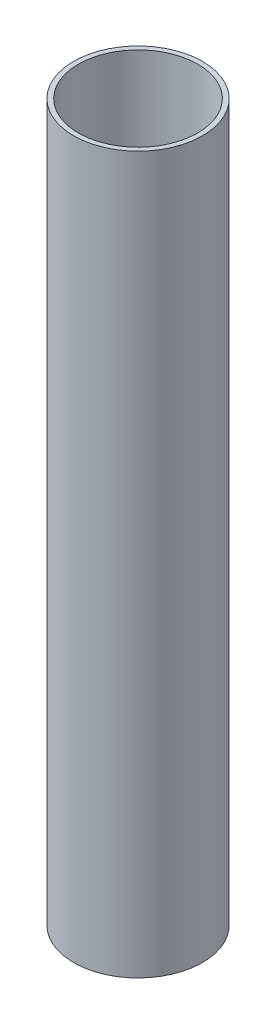
ISO-10303-21;
HEADER;
FILE_DESCRIPTION(('STEP AP214'),'2;1');
FILE_NAME('part.step','',(''),(''),'','','');
FILE_SCHEMA(('AUTOMOTIVE_DESIGN { 1 0 10303 214 1 1 1 1 }'));
ENDSEC;
DATA;
#1=APPLICATION_CONTEXT('core data for automotive mechanical design processes');
#2=APPLICATION_PROTOCOL_DEFINITION('international standard','automotive_design',2000,#1);
#3=PRODUCT_CONTEXT('',#1,'mechanical');
#4=PRODUCT('Part','Part','',(#3));
#5=PRODUCT_RELATED_PRODUCT_CATEGORY('part','',(#4));
#6=PRODUCT_DEFINITION_FORMATION('','',#4);
#7=PRODUCT_DEFINITION_CONTEXT('part definition',#1,'design');
#8=PRODUCT_DEFINITION('design','',#6,#7);
#9=PRODUCT_DEFINITION_SHAPE('','',#8);
#10=(LENGTH_UNIT() NAMED_UNIT(*) SI_UNIT(.MILLI.,.METRE.));
#11=(NAMED_UNIT(*) PLANE_ANGLE_UNIT() SI_UNIT($,.RADIAN.));
#12=(NAMED_UNIT(*) SI_UNIT($,.STERADIAN.) SOLID_ANGLE_UNIT());
#13=UNCERTAINTY_MEASURE_WITH_UNIT(LENGTH_MEASURE(1.E-05),#10,'distance_accuracy_value','');
#14=(GEOMETRIC_REPRESENTATION_CONTEXT(3) GLOBAL_UNCERTAINTY_ASSIGNED_CONTEXT((#13)) GLOBAL_UNIT_ASSIGNED_CONTEXT((#10,
#11,#12)) REPRESENTATION_CONTEXT('',''));
#15=CARTESIAN_POINT('',(0.,0.,0.));
#16=DIRECTION('',(0.,0.,1.));
#17=DIRECTION('',(1.,0.,0.));
#18=AXIS2_PLACEMENT_3D('',#15,#16,#17);
#19=CARTESIAN_POINT('',(0.,76.2,0.));
#20=DIRECTION('',(0.,1.,0.));
#21=DIRECTION('',(0.,0.,1.));
#22=AXIS2_PLACEMENT_3D('',#19,#20,#21);
#23=PLANE('',#22);
#24=CARTESIAN_POINT('',(0.,76.2,0.));
#25=DIRECTION('',(0.,1.,0.));
#26=DIRECTION('',(0.,0.,1.));
#27=AXIS2_PLACEMENT_3D('',#24,#25,#26);
#28=CIRCLE('',#27,6.858);
#29=CARTESIAN_POINT('',(0.,76.2,-6.858));
#30=VERTEX_POINT('',#29);
#31=EDGE_CURVE('E10',#30,#30,#28,.T.);
#32=ORIENTED_EDGE('',*,*,#31,.T.);
#33=EDGE_LOOP('',(#32));
#34=FACE_BOUND('',#33,.T.);
#35=CARTESIAN_POINT('',(0.,76.2,0.));
#36=DIRECTION('',(0.,1.,0.));
#37=DIRECTION('',(0.,0.,1.));
#38=AXIS2_PLACEMENT_3D('',#35,#36,#37);
#39=CIRCLE('',#38,6.35);
#40=CARTESIAN_POINT('',(0.,76.2,-6.35));
#41=VERTEX_POINT('',#40);
#42=EDGE_CURVE('E56',#41,#41,#39,.T.);
#43=ORIENTED_EDGE('',*,*,#42,.F.);
#44=EDGE_LOOP('',(#43));
#45=FACE_BOUND('',#44,.T.);
#46=ADVANCED_FACE('F43',(#34,#45),#23,.T.);
#47=CARTESIAN_POINT('',(0.,0.,0.));
#48=DIRECTION('',(0.,1.,0.));
#49=DIRECTION('',(0.,0.,1.));
#50=AXIS2_PLACEMENT_3D('',#47,#48,#49);
#51=PLANE('',#50);
#52=CARTESIAN_POINT('',(0.,0.,0.));
#53=DIRECTION('',(0.,1.,0.));
#54=DIRECTION('',(0.,0.,1.));
#55=AXIS2_PLACEMENT_3D('',#52,#53,#54);
#56=CIRCLE('',#55,6.858);
#57=CARTESIAN_POINT('',(0.,0.,-6.858));
#58=VERTEX_POINT('',#57);
#59=EDGE_CURVE('E47',#58,#58,#56,.T.);
#60=ORIENTED_EDGE('',*,*,#59,.F.);
#61=EDGE_LOOP('',(#60));
#62=FACE_BOUND('',#61,.T.);
#63=CARTESIAN_POINT('',(0.,0.,0.));
#64=DIRECTION('',(0.,1.,0.));
#65=DIRECTION('',(0.,0.,1.));
#66=AXIS2_PLACEMENT_3D('',#63,#64,#65);
#67=CIRCLE('',#66,6.35);
#68=CARTESIAN_POINT('',(0.,0.,-6.35));
#69=VERTEX_POINT('',#68);
#70=EDGE_CURVE('E58',#69,#69,#67,.T.);
#71=ORIENTED_EDGE('',*,*,#70,.T.);
#72=EDGE_LOOP('',(#71));
#73=FACE_BOUND('',#72,.T.);
#74=ADVANCED_FACE('F70',(#62,#73),#51,.F.);
#75=CARTESIAN_POINT('',(0.,76.2,0.));
#76=DIRECTION('',(0.,-1.,0.));
#77=DIRECTION('',(0.,0.,-1.));
#78=AXIS2_PLACEMENT_3D('',#75,#76,#77);
#79=CYLINDRICAL_SURFACE('',#78,6.858);
#80=CARTESIAN_POINT('',(0.,76.2,-6.858));
#81=CARTESIAN_POINT('',(0.,75.40625,-6.858));
#82=CARTESIAN_POINT('',(0.,74.6125,-6.858));
#83=CARTESIAN_POINT('',(0.,73.025,-6.858));
#84=CARTESIAN_POINT('',(0.,72.23125,-6.858));
#85=CARTESIAN_POINT('',(0.,70.64375,-6.858));
#86=CARTESIAN_POINT('',(0.,69.85,-6.858));
#87=CARTESIAN_POINT('',(0.,68.2625,-6.858));
#88=CARTESIAN_POINT('',(0.,67.46875,-6.858));
#89=CARTESIAN_POINT('',(0.,65.88125,-6.858));
#90=CARTESIAN_POINT('',(0.,65.0875,-6.858));
#91=CARTESIAN_POINT('',(0.,63.5,-6.858));
#92=CARTESIAN_POINT('',(0.,62.70625,-6.858));
#93=CARTESIAN_POINT('',(0.,61.11875,-6.858));
#94=CARTESIAN_POINT('',(0.,60.325,-6.858));
#95=CARTESIAN_POINT('',(0.,58.7375,-6.858));
#96=CARTESIAN_POINT('',(0.,57.94375,-6.858));
#97=CARTESIAN_POINT('',(0.,56.35625,-6.858));
#98=CARTESIAN_POINT('',(0.,55.5625,-6.858));
#99=CARTESIAN_POINT('',(0.,53.975,-6.858));
#100=CARTESIAN_POINT('',(0.,53.18125,-6.858));
#101=CARTESIAN_POINT('',(0.,51.59375,-6.858));
#102=CARTESIAN_POINT('',(0.,50.8,-6.858));
#103=CARTESIAN_POINT('',(0.,49.2125,-6.858));
#104=CARTESIAN_POINT('',(0.,48.41875,-6.858));
#105=CARTESIAN_POINT('',(0.,46.83125,-6.858));
#106=CARTESIAN_POINT('',(0.,46.0375,-6.858));
#107=CARTESIAN_POINT('',(0.,44.45,-6.858));
#108=CARTESIAN_POINT('',(0.,43.65625,-6.858));
#109=CARTESIAN_POINT('',(0.,42.06875,-6.858));
#110=CARTESIAN_POINT('',(0.,41.275,-6.858));
#111=CARTESIAN_POINT('',(0.,39.6875,-6.858));
#112=CARTESIAN_POINT('',(0.,38.89375,-6.858));
#113=CARTESIAN_POINT('',(0.,37.30625,-6.858));
#114=CARTESIAN_POINT('',(0.,36.5125,-6.858));
#115=CARTESIAN_POINT('',(0.,34.925,-6.858));
#116=CARTESIAN_POINT('',(0.,34.13125,-6.858));
#117=CARTESIAN_POINT('',(0.,32.54375,-6.858));
#118=CARTESIAN_POINT('',(0.,31.75,-6.858));
#119=CARTESIAN_POINT('',(0.,30.1625,-6.858));
#120=CARTESIAN_POINT('',(0.,29.36875,-6.858));
#121=CARTESIAN_POINT('',(0.,27.78125,-6.858));
#122=CARTESIAN_POINT('',(0.,26.9875,-6.858));
#123=CARTESIAN_POINT('',(0.,25.4,-6.858));
#124=CARTESIAN_POINT('',(0.,24.60625,-6.858));
#125=CARTESIAN_POINT('',(0.,23.01875,-6.858));
#126=CARTESIAN_POINT('',(0.,22.225,-6.858));
#127=CARTESIAN_POINT('',(0.,20.6375,-6.858));
#128=CARTESIAN_POINT('',(0.,19.84375,-6.858));
#129=CARTESIAN_POINT('',(0.,18.25625,-6.858));
#130=CARTESIAN_POINT('',(0.,17.4625,-6.858));
#131=CARTESIAN_POINT('',(0.,15.875,-6.858));
#132=CARTESIAN_POINT('',(0.,15.08125,-6.858));
#133=CARTESIAN_POINT('',(0.,13.49375,-6.858));
#134=CARTESIAN_POINT('',(0.,12.7,-6.858));
#135=CARTESIAN_POINT('',(0.,11.1125,-6.858));
#136=CARTESIAN_POINT('',(0.,10.31875,-6.858));
#137=CARTESIAN_POINT('',(0.,8.73125,-6.858));
#138=CARTESIAN_POINT('',(0.,7.93750000000001,-6.858));
#139=CARTESIAN_POINT('',(0.,6.35,-6.858));
#140=CARTESIAN_POINT('',(0.,5.55625,-6.858));
#141=CARTESIAN_POINT('',(0.,3.96875,-6.858));
#142=CARTESIAN_POINT('',(0.,3.175,-6.858));
#143=CARTESIAN_POINT('',(0.,1.5875,-6.858));
#144=CARTESIAN_POINT('',(0.,0.793750000000001,-6.858));
#145=CARTESIAN_POINT('',(0.,0.,-6.858));
#146=B_SPLINE_CURVE_WITH_KNOTS('',3,(#80,#81,#82,#83,#84,#85,#86,#87,#88,#89,#90,#91,#92,#93,
#94,#95,#96,#97,#98,#99,#100,#101,#102,#103,#104,#105,#106,#107,#108,#109,#110,#111,#112,#113,
#114,#115,#116,#117,#118,#119,#120,#121,#122,#123,#124,#125,#126,#127,#128,#129,#130,#131,#132,
#133,#134,#135,#136,#137,#138,#139,#140,#141,#142,#143,#144,#145),.UNSPECIFIED.,.F.,.F.,(4,2,2,
2,2,2,2,2,2,2,2,2,2,2,2,2,2,2,2,2,2,2,2,2,2,2,2,2,2,2,2,2,4),(0.,2.38124999999999,
4.76249999999999,7.14374999999999,9.52499999999999,11.90625,14.2875,16.66875,19.05,21.43125,
23.8125,26.19375,28.575,30.95625,33.3375,35.71875,38.1,40.48125,42.8625,45.24375,47.625,
50.00625,52.3875,54.76875,57.15,59.53125,61.9125,64.29375,66.675,69.05625,71.4375,73.81875,
76.2),.UNSPECIFIED.);
#147=EDGE_CURVE('BSEAM45',#30,#58,#146,.T.);
#148=ORIENTED_EDGE('',*,*,#31,.F.);
#149=ORIENTED_EDGE('',*,*,#59,.T.);
#150=ORIENTED_EDGE('',*,*,#147,.T.);
#151=ORIENTED_EDGE('',*,*,#147,.F.);
#152=EDGE_LOOP('',(#148,#150,#149,#151));
#153=FACE_BOUND('',#152,.T.);
#154=ADVANCED_FACE('F45',(#153),#79,.T.);
#155=CARTESIAN_POINT('',(0.,76.2,0.));
#156=DIRECTION('',(0.,-1.,0.));
#157=DIRECTION('',(0.,0.,-1.));
#158=AXIS2_PLACEMENT_3D('',#155,#156,#157);
#159=CYLINDRICAL_SURFACE('',#158,6.35);
#160=CARTESIAN_POINT('',(0.,76.2,-6.35));
#161=CARTESIAN_POINT('',(0.,75.40625,-6.35));
#162=CARTESIAN_POINT('',(0.,74.6125,-6.35));
#163=CARTESIAN_POINT('',(0.,73.025,-6.35));
#164=CARTESIAN_POINT('',(0.,72.23125,-6.35));
#165=CARTESIAN_POINT('',(0.,70.64375,-6.35));
#166=CARTESIAN_POINT('',(0.,69.85,-6.35));
#167=CARTESIAN_POINT('',(0.,68.2625,-6.35));
#168=CARTESIAN_POINT('',(0.,67.46875,-6.35));
#169=CARTESIAN_POINT('',(0.,65.88125,-6.35));
#170=CARTESIAN_POINT('',(0.,65.0875,-6.35));
#171=CARTESIAN_POINT('',(0.,63.5,-6.35));
#172=CARTESIAN_POINT('',(0.,62.70625,-6.35));
#173=CARTESIAN_POINT('',(0.,61.11875,-6.35));
#174=CARTESIAN_POINT('',(0.,60.325,-6.35));
#175=CARTESIAN_POINT('',(0.,58.7375,-6.35));
#176=CARTESIAN_POINT('',(0.,57.94375,-6.35));
#177=CARTESIAN_POINT('',(0.,56.35625,-6.35));
#178=CARTESIAN_POINT('',(0.,55.5625,-6.35));
#179=CARTESIAN_POINT('',(0.,53.975,-6.35));
#180=CARTESIAN_POINT('',(0.,53.18125,-6.35));
#181=CARTESIAN_POINT('',(0.,51.59375,-6.35));
#182=CARTESIAN_POINT('',(0.,50.8,-6.35));
#183=CARTESIAN_POINT('',(0.,49.2125,-6.35));
#184=CARTESIAN_POINT('',(0.,48.41875,-6.35));
#185=CARTESIAN_POINT('',(0.,46.83125,-6.35));
#186=CARTESIAN_POINT('',(0.,46.0375,-6.35));
#187=CARTESIAN_POINT('',(0.,44.45,-6.35));
#188=CARTESIAN_POINT('',(0.,43.65625,-6.35));
#189=CARTESIAN_POINT('',(0.,42.06875,-6.35));
#190=CARTESIAN_POINT('',(0.,41.275,-6.35));
#191=CARTESIAN_POINT('',(0.,39.6875,-6.35));
#192=CARTESIAN_POINT('',(0.,38.89375,-6.35));
#193=CARTESIAN_POINT('',(0.,37.30625,-6.35));
#194=CARTESIAN_POINT('',(0.,36.5125,-6.35));
#195=CARTESIAN_POINT('',(0.,34.925,-6.35));
#196=CARTESIAN_POINT('',(0.,34.13125,-6.35));
#197=CARTESIAN_POINT('',(0.,32.54375,-6.35));
#198=CARTESIAN_POINT('',(0.,31.75,-6.35));
#199=CARTESIAN_POINT('',(0.,30.1625,-6.35));
#200=CARTESIAN_POINT('',(0.,29.36875,-6.35));
#201=CARTESIAN_POINT('',(0.,27.78125,-6.35));
#202=CARTESIAN_POINT('',(0.,26.9875,-6.35));
#203=CARTESIAN_POINT('',(0.,25.4,-6.35));
#204=CARTESIAN_POINT('',(0.,24.60625,-6.35));
#205=CARTESIAN_POINT('',(0.,23.01875,-6.35));
#206=CARTESIAN_POINT('',(0.,22.225,-6.35));
#207=CARTESIAN_POINT('',(0.,20.6375,-6.35));
#208=CARTESIAN_POINT('',(0.,19.84375,-6.35));
#209=CARTESIAN_POINT('',(0.,18.25625,-6.35));
#210=CARTESIAN_POINT('',(0.,17.4625,-6.35));
#211=CARTESIAN_POINT('',(0.,15.875,-6.35));
#212=CARTESIAN_POINT('',(0.,15.08125,-6.35));
#213=CARTESIAN_POINT('',(0.,13.49375,-6.35));
#214=CARTESIAN_POINT('',(0.,12.7,-6.35));
#215=CARTESIAN_POINT('',(0.,11.1125,-6.35));
#216=CARTESIAN_POINT('',(0.,10.31875,-6.35));
#217=CARTESIAN_POINT('',(0.,8.73125,-6.35));
#218=CARTESIAN_POINT('',(0.,7.93750000000001,-6.35));
#219=CARTESIAN_POINT('',(0.,6.35,-6.35));
#220=CARTESIAN_POINT('',(0.,5.55625,-6.35));
#221=CARTESIAN_POINT('',(0.,3.96875,-6.35));
#222=CARTESIAN_POINT('',(0.,3.175,-6.35));
#223=CARTESIAN_POINT('',(0.,1.5875,-6.35));
#224=CARTESIAN_POINT('',(0.,0.793750000000001,-6.35));
#225=CARTESIAN_POINT('',(0.,0.,-6.35));
#226=B_SPLINE_CURVE_WITH_KNOTS('',3,(#160,#161,#162,#163,#164,#165,#166,#167,#168,#169,#170,
#171,#172,#173,#174,#175,#176,#177,#178,#179,#180,#181,#182,#183,#184,#185,#186,#187,#188,#189,
#190,#191,#192,#193,#194,#195,#196,#197,#198,#199,#200,#201,#202,#203,#204,#205,#206,#207,#208,
#209,#210,#211,#212,#213,#214,#215,#216,#217,#218,#219,#220,#221,#222,#223,#224,#225),
.UNSPECIFIED.,.F.,.F.,(4,2,2,2,2,2,2,2,2,2,2,2,2,2,2,2,2,2,2,2,2,2,2,2,2,2,2,2,2,2,2,2,4),(0.,
2.38124999999999,4.76249999999999,7.14374999999999,9.52499999999999,11.90625,14.2875,16.66875,
19.05,21.43125,23.8125,26.19375,28.575,30.95625,33.3375,35.71875,38.1,40.48125,42.8625,45.24375,
47.625,50.00625,52.3875,54.76875,57.15,59.53125,61.9125,64.29375,66.675,69.05625,71.4375,
73.81875,76.2),.UNSPECIFIED.);
#227=EDGE_CURVE('BSEAM66',#41,#69,#226,.T.);
#228=ORIENTED_EDGE('',*,*,#42,.T.);
#229=ORIENTED_EDGE('',*,*,#70,.F.);
#230=ORIENTED_EDGE('',*,*,#227,.T.);
#231=ORIENTED_EDGE('',*,*,#227,.F.);
#232=EDGE_LOOP('',(#228,#230,#229,#231));
#233=FACE_BOUND('',#232,.T.);
#234=ADVANCED_FACE('F66',(#233),#159,.F.);
#235=CLOSED_SHELL('',(#46,#74,#154,#234));
#236=MANIFOLD_SOLID_BREP('B2',#235);
#237=ADVANCED_BREP_SHAPE_REPRESENTATION('',(#18,#236),#14);
#238=SHAPE_DEFINITION_REPRESENTATION(#9,#237);
ENDSEC;
END-ISO-10303-21;
